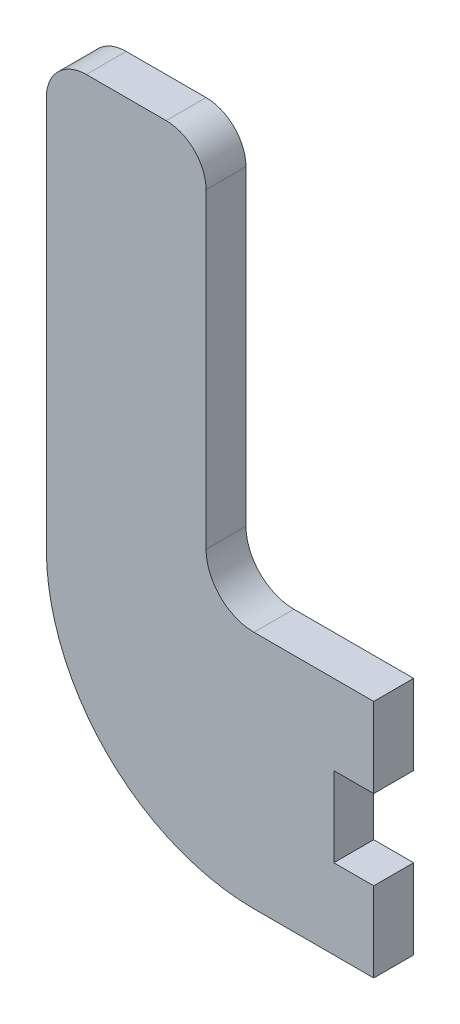
ISO-10303-21;
HEADER;
FILE_DESCRIPTION(('STEP AP214'),'2;1');
FILE_NAME('part.step','',(''),(''),'','','');
FILE_SCHEMA(('AUTOMOTIVE_DESIGN { 1 0 10303 214 1 1 1 1 }'));
ENDSEC;
DATA;
#1=APPLICATION_CONTEXT('core data for automotive mechanical design processes');
#2=APPLICATION_PROTOCOL_DEFINITION('international standard','automotive_design',2000,#1);
#3=PRODUCT_CONTEXT('',#1,'mechanical');
#4=PRODUCT('Part','Part','',(#3));
#5=PRODUCT_RELATED_PRODUCT_CATEGORY('part','',(#4));
#6=PRODUCT_DEFINITION_FORMATION('','',#4);
#7=PRODUCT_DEFINITION_CONTEXT('part definition',#1,'design');
#8=PRODUCT_DEFINITION('design','',#6,#7);
#9=PRODUCT_DEFINITION_SHAPE('','',#8);
#10=(LENGTH_UNIT() NAMED_UNIT(*) SI_UNIT(.MILLI.,.METRE.));
#11=(NAMED_UNIT(*) PLANE_ANGLE_UNIT() SI_UNIT($,.RADIAN.));
#12=(NAMED_UNIT(*) SI_UNIT($,.STERADIAN.) SOLID_ANGLE_UNIT());
#13=UNCERTAINTY_MEASURE_WITH_UNIT(LENGTH_MEASURE(1.E-05),#10,'distance_accuracy_value','');
#14=(GEOMETRIC_REPRESENTATION_CONTEXT(3) GLOBAL_UNCERTAINTY_ASSIGNED_CONTEXT((#13)) GLOBAL_UNIT_ASSIGNED_CONTEXT((#10,
#11,#12)) REPRESENTATION_CONTEXT('',''));
#15=CARTESIAN_POINT('',(0.,0.,0.));
#16=DIRECTION('',(0.,0.,1.));
#17=DIRECTION('',(1.,0.,0.));
#18=AXIS2_PLACEMENT_3D('',#15,#16,#17);
#19=CARTESIAN_POINT('',(0.,0.,3.175));
#20=DIRECTION('',(0.,1.,0.));
#21=DIRECTION('',(-1.,0.,0.));
#22=AXIS2_PLACEMENT_3D('',#19,#20,#21);
#23=PLANE('',#22);
#24=DIRECTION('',(1.,0.,0.));
#25=VECTOR('',#24,1.);
#26=CARTESIAN_POINT('',(0.,0.,0.));
#27=LINE('',#26,#25);
#28=CARTESIAN_POINT('',(-6.35,0.,0.));
#29=VERTEX_POINT('',#28);
#30=CARTESIAN_POINT('',(3.175,0.,0.));
#31=VERTEX_POINT('',#30);
#32=EDGE_CURVE('E150',#29,#31,#27,.T.);
#33=ORIENTED_EDGE('',*,*,#32,.T.);
#34=DIRECTION('',(0.,0.,-1.));
#35=VECTOR('',#34,1.);
#36=CARTESIAN_POINT('',(3.175,0.,3.175));
#37=LINE('',#36,#35);
#38=CARTESIAN_POINT('',(3.175,0.,3.175));
#39=VERTEX_POINT('',#38);
#40=EDGE_CURVE('E149',#39,#31,#37,.T.);
#41=ORIENTED_EDGE('',*,*,#40,.F.);
#42=DIRECTION('',(1.,0.,0.));
#43=VECTOR('',#42,1.);
#44=CARTESIAN_POINT('',(0.,0.,3.175));
#45=LINE('',#44,#43);
#46=CARTESIAN_POINT('',(-6.35,0.,3.175));
#47=VERTEX_POINT('',#46);
#48=EDGE_CURVE('E135',#47,#39,#45,.T.);
#49=ORIENTED_EDGE('',*,*,#48,.F.);
#50=DIRECTION('',(0.,0.,-1.));
#51=VECTOR('',#50,1.);
#52=CARTESIAN_POINT('',(-6.35,0.,3.175));
#53=LINE('',#52,#51);
#54=EDGE_CURVE('E180',#47,#29,#53,.T.);
#55=ORIENTED_EDGE('',*,*,#54,.T.);
#56=EDGE_LOOP('',(#33,#41,#49,#55));
#57=FACE_BOUND('',#56,.T.);
#58=ADVANCED_FACE('F33',(#57),#23,.F.);
#59=CARTESIAN_POINT('',(3.175,0.,3.175));
#60=DIRECTION('',(-1.,0.,0.));
#61=DIRECTION('',(0.,0.,1.));
#62=AXIS2_PLACEMENT_3D('',#59,#60,#61);
#63=PLANE('',#62);
#64=DIRECTION('',(0.,1.,0.));
#65=VECTOR('',#64,1.);
#66=CARTESIAN_POINT('',(3.175,0.,0.));
#67=LINE('',#66,#65);
#68=CARTESIAN_POINT('',(3.175,6.35,0.));
#69=VERTEX_POINT('',#68);
#70=EDGE_CURVE('E182',#31,#69,#67,.T.);
#71=ORIENTED_EDGE('',*,*,#70,.T.);
#72=DIRECTION('',(0.,0.,-1.));
#73=VECTOR('',#72,1.);
#74=CARTESIAN_POINT('',(3.175,6.35,3.175));
#75=LINE('',#74,#73);
#76=CARTESIAN_POINT('',(3.175,6.35,3.175));
#77=VERTEX_POINT('',#76);
#78=EDGE_CURVE('E154',#77,#69,#75,.T.);
#79=ORIENTED_EDGE('',*,*,#78,.F.);
#80=DIRECTION('',(0.,1.,0.));
#81=VECTOR('',#80,1.);
#82=CARTESIAN_POINT('',(3.175,0.,3.175));
#83=LINE('',#82,#81);
#84=EDGE_CURVE('E139',#39,#77,#83,.T.);
#85=ORIENTED_EDGE('',*,*,#84,.F.);
#86=ORIENTED_EDGE('',*,*,#40,.T.);
#87=EDGE_LOOP('',(#71,#79,#85,#86));
#88=FACE_BOUND('',#87,.T.);
#89=ADVANCED_FACE('F156',(#88),#63,.F.);
#90=CARTESIAN_POINT('',(3.175,6.35,3.175));
#91=DIRECTION('',(0.,-1.,0.));
#92=DIRECTION('',(1.,0.,0.));
#93=AXIS2_PLACEMENT_3D('',#90,#91,#92);
#94=PLANE('',#93);
#95=DIRECTION('',(-1.,0.,0.));
#96=VECTOR('',#95,1.);
#97=CARTESIAN_POINT('',(3.175,6.35,0.));
#98=LINE('',#97,#96);
#99=CARTESIAN_POINT('',(0.,6.35,0.));
#100=VERTEX_POINT('',#99);
#101=EDGE_CURVE('E184',#69,#100,#98,.T.);
#102=ORIENTED_EDGE('',*,*,#101,.T.);
#103=DIRECTION('',(0.,0.,-1.));
#104=VECTOR('',#103,1.);
#105=CARTESIAN_POINT('',(0.,6.35,3.175));
#106=LINE('',#105,#104);
#107=CARTESIAN_POINT('',(0.,6.35,3.175));
#108=VERTEX_POINT('',#107);
#109=EDGE_CURVE('E225',#108,#100,#106,.T.);
#110=ORIENTED_EDGE('',*,*,#109,.F.);
#111=DIRECTION('',(-1.,0.,0.));
#112=VECTOR('',#111,1.);
#113=CARTESIAN_POINT('',(3.175,6.35,3.175));
#114=LINE('',#113,#112);
#115=EDGE_CURVE('E159',#77,#108,#114,.T.);
#116=ORIENTED_EDGE('',*,*,#115,.F.);
#117=ORIENTED_EDGE('',*,*,#78,.T.);
#118=EDGE_LOOP('',(#102,#110,#116,#117));
#119=FACE_BOUND('',#118,.T.);
#120=ADVANCED_FACE('F278',(#119),#94,.F.);
#121=CARTESIAN_POINT('',(0.,6.35,3.175));
#122=DIRECTION('',(-1.,0.,0.));
#123=DIRECTION('',(0.,0.,1.));
#124=AXIS2_PLACEMENT_3D('',#121,#122,#123);
#125=PLANE('',#124);
#126=DIRECTION('',(0.,1.,0.));
#127=VECTOR('',#126,1.);
#128=CARTESIAN_POINT('',(0.,6.35,0.));
#129=LINE('',#128,#127);
#130=CARTESIAN_POINT('',(0.,12.7,0.));
#131=VERTEX_POINT('',#130);
#132=EDGE_CURVE('E186',#100,#131,#129,.T.);
#133=ORIENTED_EDGE('',*,*,#132,.T.);
#134=DIRECTION('',(0.,0.,-1.));
#135=VECTOR('',#134,1.);
#136=CARTESIAN_POINT('',(0.,12.7,3.175));
#137=LINE('',#136,#135);
#138=CARTESIAN_POINT('',(0.,12.7,3.175));
#139=VERTEX_POINT('',#138);
#140=EDGE_CURVE('E222',#139,#131,#137,.T.);
#141=ORIENTED_EDGE('',*,*,#140,.F.);
#142=DIRECTION('',(0.,1.,0.));
#143=VECTOR('',#142,1.);
#144=CARTESIAN_POINT('',(0.,6.35,3.175));
#145=LINE('',#144,#143);
#146=EDGE_CURVE('E161',#108,#139,#145,.T.);
#147=ORIENTED_EDGE('',*,*,#146,.F.);
#148=ORIENTED_EDGE('',*,*,#109,.T.);
#149=EDGE_LOOP('',(#133,#141,#147,#148));
#150=FACE_BOUND('',#149,.T.);
#151=ADVANCED_FACE('F275',(#150),#125,.F.);
#152=CARTESIAN_POINT('',(0.,12.7,3.175));
#153=DIRECTION('',(0.,1.,0.));
#154=DIRECTION('',(-1.,0.,0.));
#155=AXIS2_PLACEMENT_3D('',#152,#153,#154);
#156=PLANE('',#155);
#157=DIRECTION('',(1.,0.,0.));
#158=VECTOR('',#157,1.);
#159=CARTESIAN_POINT('',(0.,12.7,0.));
#160=LINE('',#159,#158);
#161=CARTESIAN_POINT('',(3.175,12.7,0.));
#162=VERTEX_POINT('',#161);
#163=EDGE_CURVE('E188',#131,#162,#160,.T.);
#164=ORIENTED_EDGE('',*,*,#163,.T.);
#165=DIRECTION('',(0.,0.,-1.));
#166=VECTOR('',#165,1.);
#167=CARTESIAN_POINT('',(3.175,12.7,3.175));
#168=LINE('',#167,#166);
#169=CARTESIAN_POINT('',(3.175,12.7,3.175));
#170=VERTEX_POINT('',#169);
#171=EDGE_CURVE('E219',#170,#162,#168,.T.);
#172=ORIENTED_EDGE('',*,*,#171,.F.);
#173=DIRECTION('',(1.,0.,0.));
#174=VECTOR('',#173,1.);
#175=CARTESIAN_POINT('',(0.,12.7,3.175));
#176=LINE('',#175,#174);
#177=EDGE_CURVE('E165',#139,#170,#176,.T.);
#178=ORIENTED_EDGE('',*,*,#177,.F.);
#179=ORIENTED_EDGE('',*,*,#140,.T.);
#180=EDGE_LOOP('',(#164,#172,#178,#179));
#181=FACE_BOUND('',#180,.T.);
#182=ADVANCED_FACE('F271',(#181),#156,.F.);
#183=CARTESIAN_POINT('',(3.175,12.7,3.175));
#184=DIRECTION('',(-1.,0.,0.));
#185=DIRECTION('',(0.,0.,1.));
#186=AXIS2_PLACEMENT_3D('',#183,#184,#185);
#187=PLANE('',#186);
#188=DIRECTION('',(0.,1.,0.));
#189=VECTOR('',#188,1.);
#190=CARTESIAN_POINT('',(3.175,12.7,0.));
#191=LINE('',#190,#189);
#192=CARTESIAN_POINT('',(3.175,19.05,0.));
#193=VERTEX_POINT('',#192);
#194=EDGE_CURVE('E190',#162,#193,#191,.T.);
#195=ORIENTED_EDGE('',*,*,#194,.T.);
#196=DIRECTION('',(0.,0.,-1.));
#197=VECTOR('',#196,1.);
#198=CARTESIAN_POINT('',(3.175,19.05,3.175));
#199=LINE('',#198,#197);
#200=CARTESIAN_POINT('',(3.175,19.05,3.175));
#201=VERTEX_POINT('',#200);
#202=EDGE_CURVE('E216',#201,#193,#199,.T.);
#203=ORIENTED_EDGE('',*,*,#202,.F.);
#204=DIRECTION('',(0.,1.,0.));
#205=VECTOR('',#204,1.);
#206=CARTESIAN_POINT('',(3.175,12.7,3.175));
#207=LINE('',#206,#205);
#208=EDGE_CURVE('E167',#170,#201,#207,.T.);
#209=ORIENTED_EDGE('',*,*,#208,.F.);
#210=ORIENTED_EDGE('',*,*,#171,.T.);
#211=EDGE_LOOP('',(#195,#203,#209,#210));
#212=FACE_BOUND('',#211,.T.);
#213=ADVANCED_FACE('F262',(#212),#187,.F.);
#214=CARTESIAN_POINT('',(0.,19.05,3.175));
#215=DIRECTION('',(0.,-1.,0.));
#216=DIRECTION('',(0.,0.,-1.));
#217=AXIS2_PLACEMENT_3D('',#214,#215,#216);
#218=PLANE('',#217);
#219=DIRECTION('',(-1.,0.,0.));
#220=VECTOR('',#219,1.);
#221=CARTESIAN_POINT('',(0.,19.05,0.));
#222=LINE('',#221,#220);
#223=CARTESIAN_POINT('',(-6.35,19.05,0.));
#224=VERTEX_POINT('',#223);
#225=EDGE_CURVE('E193',#193,#224,#222,.T.);
#226=ORIENTED_EDGE('',*,*,#225,.T.);
#227=DIRECTION('',(0.,0.,-1.));
#228=VECTOR('',#227,1.);
#229=CARTESIAN_POINT('',(-6.35,19.05,3.175));
#230=LINE('',#229,#228);
#231=CARTESIAN_POINT('',(-6.35,19.05,3.175));
#232=VERTEX_POINT('',#231);
#233=EDGE_CURVE('E213',#232,#224,#230,.T.);
#234=ORIENTED_EDGE('',*,*,#233,.F.);
#235=DIRECTION('',(-1.,0.,0.));
#236=VECTOR('',#235,1.);
#237=CARTESIAN_POINT('',(3.175,19.05,3.175));
#238=LINE('',#237,#236);
#239=EDGE_CURVE('E169',#201,#232,#238,.T.);
#240=ORIENTED_EDGE('',*,*,#239,.F.);
#241=ORIENTED_EDGE('',*,*,#202,.T.);
#242=EDGE_LOOP('',(#226,#234,#240,#241));
#243=FACE_BOUND('',#242,.T.);
#244=ADVANCED_FACE('F266',(#243),#218,.F.);
#245=CARTESIAN_POINT('',(-6.35,22.86,3.175));
#246=DIRECTION('',(0.,0.,-1.));
#247=DIRECTION('',(-1.,0.,0.));
#248=AXIS2_PLACEMENT_3D('',#245,#246,#247);
#249=CYLINDRICAL_SURFACE('',#248,3.80999999999999);
#250=CARTESIAN_POINT('',(-6.35,22.86,0.));
#251=DIRECTION('',(0.,0.,-1.));
#252=DIRECTION('',(-1.,0.,0.));
#253=AXIS2_PLACEMENT_3D('',#250,#251,#252);
#254=CIRCLE('',#253,3.80999999999999);
#255=CARTESIAN_POINT('',(-10.16,22.86,0.));
#256=VERTEX_POINT('',#255);
#257=EDGE_CURVE('E195',#224,#256,#254,.T.);
#258=ORIENTED_EDGE('',*,*,#257,.T.);
#259=DIRECTION('',(0.,0.,-1.));
#260=VECTOR('',#259,1.);
#261=CARTESIAN_POINT('',(-10.16,22.86,3.175));
#262=LINE('',#261,#260);
#263=CARTESIAN_POINT('',(-10.16,22.86,3.175));
#264=VERTEX_POINT('',#263);
#265=EDGE_CURVE('E210',#264,#256,#262,.T.);
#266=ORIENTED_EDGE('',*,*,#265,.F.);
#267=CARTESIAN_POINT('',(-6.35,22.86,3.175));
#268=DIRECTION('',(0.,0.,-1.));
#269=DIRECTION('',(-1.,0.,0.));
#270=AXIS2_PLACEMENT_3D('',#267,#268,#269);
#271=CIRCLE('',#270,3.80999999999999);
#272=EDGE_CURVE('E171',#232,#264,#271,.T.);
#273=ORIENTED_EDGE('',*,*,#272,.F.);
#274=ORIENTED_EDGE('',*,*,#233,.T.);
#275=EDGE_LOOP('',(#258,#266,#273,#274));
#276=FACE_BOUND('',#275,.T.);
#277=ADVANCED_FACE('F255',(#276),#249,.F.);
#278=CARTESIAN_POINT('',(-10.16,22.86,3.175));
#279=DIRECTION('',(-1.,0.,0.));
#280=DIRECTION('',(0.,-1.,0.));
#281=AXIS2_PLACEMENT_3D('',#278,#279,#280);
#282=PLANE('',#281);
#283=DIRECTION('',(0.,1.,0.));
#284=VECTOR('',#283,1.);
#285=CARTESIAN_POINT('',(-10.16,22.86,0.));
#286=LINE('',#285,#284);
#287=CARTESIAN_POINT('',(-10.16,47.625,0.));
#288=VERTEX_POINT('',#287);
#289=EDGE_CURVE('E197',#256,#288,#286,.T.);
#290=ORIENTED_EDGE('',*,*,#289,.T.);
#291=DIRECTION('',(0.,0.,-1.));
#292=VECTOR('',#291,1.);
#293=CARTESIAN_POINT('',(-10.16,47.625,3.175));
#294=LINE('',#293,#292);
#295=CARTESIAN_POINT('',(-10.16,47.625,3.175));
#296=VERTEX_POINT('',#295);
#297=EDGE_CURVE('E56',#288,#296,#294,.F.);
#298=ORIENTED_EDGE('',*,*,#297,.T.);
#299=DIRECTION('',(0.,1.,0.));
#300=VECTOR('',#299,1.);
#301=CARTESIAN_POINT('',(-10.16,22.86,3.175));
#302=LINE('',#301,#300);
#303=EDGE_CURVE('E173',#264,#296,#302,.T.);
#304=ORIENTED_EDGE('',*,*,#303,.F.);
#305=ORIENTED_EDGE('',*,*,#265,.T.);
#306=EDGE_LOOP('',(#290,#298,#304,#305));
#307=FACE_BOUND('',#306,.T.);
#308=ADVANCED_FACE('F251',(#307),#282,.F.);
#309=CARTESIAN_POINT('',(-22.86,50.8,3.175));
#310=DIRECTION('',(0.,-1.,0.));
#311=DIRECTION('',(0.,0.,-1.));
#312=AXIS2_PLACEMENT_3D('',#309,#310,#311);
#313=PLANE('',#312);
#314=DIRECTION('',(-1.,0.,0.));
#315=VECTOR('',#314,1.);
#316=CARTESIAN_POINT('',(-22.86,50.8,3.175));
#317=LINE('',#316,#315);
#318=CARTESIAN_POINT('',(-13.335,50.8,3.175));
#319=VERTEX_POINT('',#318);
#320=CARTESIAN_POINT('',(-19.685,50.8,3.175));
#321=VERTEX_POINT('',#320);
#322=EDGE_CURVE('E175',#319,#321,#317,.T.);
#323=ORIENTED_EDGE('',*,*,#322,.F.);
#324=DIRECTION('',(0.,0.,-1.));
#325=VECTOR('',#324,1.);
#326=CARTESIAN_POINT('',(-13.335,50.8,3.175));
#327=LINE('',#326,#325);
#328=CARTESIAN_POINT('',(-13.335,50.8,0.));
#329=VERTEX_POINT('',#328);
#330=EDGE_CURVE('E230',#319,#329,#327,.T.);
#331=ORIENTED_EDGE('',*,*,#330,.T.);
#332=DIRECTION('',(-1.,0.,0.));
#333=VECTOR('',#332,1.);
#334=CARTESIAN_POINT('',(-22.86,50.8,0.));
#335=LINE('',#334,#333);
#336=CARTESIAN_POINT('',(-19.685,50.8,0.));
#337=VERTEX_POINT('',#336);
#338=EDGE_CURVE('E199',#329,#337,#335,.T.);
#339=ORIENTED_EDGE('',*,*,#338,.T.);
#340=DIRECTION('',(0.,0.,-1.));
#341=VECTOR('',#340,1.);
#342=CARTESIAN_POINT('',(-19.685,50.8,3.175));
#343=LINE('',#342,#341);
#344=EDGE_CURVE('E153',#337,#321,#343,.F.);
#345=ORIENTED_EDGE('',*,*,#344,.T.);
#346=EDGE_LOOP('',(#323,#331,#339,#345));
#347=FACE_BOUND('',#346,.T.);
#348=ADVANCED_FACE('F243',(#347),#313,.F.);
#349=CARTESIAN_POINT('',(-22.86,16.51,3.175));
#350=DIRECTION('',(1.,0.,0.));
#351=DIRECTION('',(0.,0.,-1.));
#352=AXIS2_PLACEMENT_3D('',#349,#350,#351);
#353=PLANE('',#352);
#354=DIRECTION('',(0.,-1.,0.));
#355=VECTOR('',#354,1.);
#356=CARTESIAN_POINT('',(-22.86,16.51,3.175));
#357=LINE('',#356,#355);
#358=CARTESIAN_POINT('',(-22.86,47.625,3.175));
#359=VERTEX_POINT('',#358);
#360=CARTESIAN_POINT('',(-22.86,16.51,3.175));
#361=VERTEX_POINT('',#360);
#362=EDGE_CURVE('E177',#359,#361,#357,.T.);
#363=ORIENTED_EDGE('',*,*,#362,.F.);
#364=DIRECTION('',(0.,0.,-1.));
#365=VECTOR('',#364,1.);
#366=CARTESIAN_POINT('',(-22.86,47.625,3.175));
#367=LINE('',#366,#365);
#368=CARTESIAN_POINT('',(-22.86,47.625,0.));
#369=VERTEX_POINT('',#368);
#370=EDGE_CURVE('E11',#359,#369,#367,.T.);
#371=ORIENTED_EDGE('',*,*,#370,.T.);
#372=DIRECTION('',(0.,-1.,0.));
#373=VECTOR('',#372,1.);
#374=CARTESIAN_POINT('',(-22.86,16.51,0.));
#375=LINE('',#374,#373);
#376=CARTESIAN_POINT('',(-22.86,16.51,0.));
#377=VERTEX_POINT('',#376);
#378=EDGE_CURVE('E202',#369,#377,#375,.T.);
#379=ORIENTED_EDGE('',*,*,#378,.T.);
#380=DIRECTION('',(0.,0.,-1.));
#381=VECTOR('',#380,1.);
#382=CARTESIAN_POINT('',(-22.86,16.51,3.175));
#383=LINE('',#382,#381);
#384=EDGE_CURVE('E207',#361,#377,#383,.T.);
#385=ORIENTED_EDGE('',*,*,#384,.F.);
#386=EDGE_LOOP('',(#363,#371,#379,#385));
#387=FACE_BOUND('',#386,.T.);
#388=ADVANCED_FACE('F306',(#387),#353,.F.);
#389=CARTESIAN_POINT('',(-6.35,16.51,3.175));
#390=DIRECTION('',(0.,0.,-1.));
#391=DIRECTION('',(-1.,0.,0.));
#392=AXIS2_PLACEMENT_3D('',#389,#390,#391);
#393=CYLINDRICAL_SURFACE('',#392,16.51);
#394=CARTESIAN_POINT('',(-6.35,16.51,0.));
#395=DIRECTION('',(0.,0.,1.));
#396=DIRECTION('',(-1.,0.,0.));
#397=AXIS2_PLACEMENT_3D('',#394,#395,#396);
#398=CIRCLE('',#397,16.51);
#399=EDGE_CURVE('E146',#377,#29,#398,.T.);
#400=ORIENTED_EDGE('',*,*,#399,.T.);
#401=ORIENTED_EDGE('',*,*,#54,.F.);
#402=CARTESIAN_POINT('',(-6.35,16.51,3.175));
#403=DIRECTION('',(0.,0.,1.));
#404=DIRECTION('',(-1.,0.,0.));
#405=AXIS2_PLACEMENT_3D('',#402,#403,#404);
#406=CIRCLE('',#405,16.51);
#407=EDGE_CURVE('E142',#361,#47,#406,.T.);
#408=ORIENTED_EDGE('',*,*,#407,.F.);
#409=ORIENTED_EDGE('',*,*,#384,.T.);
#410=EDGE_LOOP('',(#400,#401,#408,#409));
#411=FACE_BOUND('',#410,.T.);
#412=ADVANCED_FACE('F301',(#411),#393,.T.);
#413=CARTESIAN_POINT('',(-6.35,16.51,3.175));
#414=DIRECTION('',(0.,0.,-1.));
#415=DIRECTION('',(-1.,0.,0.));
#416=AXIS2_PLACEMENT_3D('',#413,#414,#415);
#417=PLANE('',#416);
#418=ORIENTED_EDGE('',*,*,#303,.T.);
#419=CARTESIAN_POINT('',(-13.335,47.625,3.175));
#420=DIRECTION('',(0.,0.,-1.));
#421=DIRECTION('',(-1.,0.,0.));
#422=AXIS2_PLACEMENT_3D('',#419,#420,#421);
#423=CIRCLE('',#422,3.175);
#424=EDGE_CURVE('E41',#296,#319,#423,.F.);
#425=ORIENTED_EDGE('',*,*,#424,.T.);
#426=ORIENTED_EDGE('',*,*,#322,.T.);
#427=CARTESIAN_POINT('',(-19.685,47.625,3.175));
#428=DIRECTION('',(0.,0.,-1.));
#429=DIRECTION('',(-1.,0.,0.));
#430=AXIS2_PLACEMENT_3D('',#427,#428,#429);
#431=CIRCLE('',#430,3.175);
#432=EDGE_CURVE('E48',#321,#359,#431,.F.);
#433=ORIENTED_EDGE('',*,*,#432,.T.);
#434=ORIENTED_EDGE('',*,*,#362,.T.);
#435=ORIENTED_EDGE('',*,*,#407,.T.);
#436=ORIENTED_EDGE('',*,*,#48,.T.);
#437=ORIENTED_EDGE('',*,*,#84,.T.);
#438=ORIENTED_EDGE('',*,*,#115,.T.);
#439=ORIENTED_EDGE('',*,*,#146,.T.);
#440=ORIENTED_EDGE('',*,*,#177,.T.);
#441=ORIENTED_EDGE('',*,*,#208,.T.);
#442=ORIENTED_EDGE('',*,*,#239,.T.);
#443=ORIENTED_EDGE('',*,*,#272,.T.);
#444=EDGE_LOOP('',(#418,#425,#426,#433,#434,#435,#436,#437,#438,#439,#440,#441,#442,#443));
#445=FACE_BOUND('',#444,.T.);
#446=ADVANCED_FACE('F137',(#445),#417,.F.);
#447=CARTESIAN_POINT('',(-6.35,16.51,0.));
#448=DIRECTION('',(0.,0.,-1.));
#449=DIRECTION('',(-1.,0.,0.));
#450=AXIS2_PLACEMENT_3D('',#447,#448,#449);
#451=PLANE('',#450);
#452=ORIENTED_EDGE('',*,*,#338,.F.);
#453=CARTESIAN_POINT('',(-13.335,47.625,0.));
#454=DIRECTION('',(0.,0.,-1.));
#455=DIRECTION('',(-1.,0.,0.));
#456=AXIS2_PLACEMENT_3D('',#453,#454,#455);
#457=CIRCLE('',#456,3.175);
#458=EDGE_CURVE('E235',#329,#288,#457,.T.);
#459=ORIENTED_EDGE('',*,*,#458,.T.);
#460=ORIENTED_EDGE('',*,*,#289,.F.);
#461=ORIENTED_EDGE('',*,*,#257,.F.);
#462=ORIENTED_EDGE('',*,*,#225,.F.);
#463=ORIENTED_EDGE('',*,*,#194,.F.);
#464=ORIENTED_EDGE('',*,*,#163,.F.);
#465=ORIENTED_EDGE('',*,*,#132,.F.);
#466=ORIENTED_EDGE('',*,*,#101,.F.);
#467=ORIENTED_EDGE('',*,*,#70,.F.);
#468=ORIENTED_EDGE('',*,*,#32,.F.);
#469=ORIENTED_EDGE('',*,*,#399,.F.);
#470=ORIENTED_EDGE('',*,*,#378,.F.);
#471=CARTESIAN_POINT('',(-19.685,47.625,0.));
#472=DIRECTION('',(0.,0.,-1.));
#473=DIRECTION('',(-1.,0.,0.));
#474=AXIS2_PLACEMENT_3D('',#471,#472,#473);
#475=CIRCLE('',#474,3.175);
#476=EDGE_CURVE('E233',#369,#337,#475,.T.);
#477=ORIENTED_EDGE('',*,*,#476,.T.);
#478=EDGE_LOOP('',(#452,#459,#460,#461,#462,#463,#464,#465,#466,#467,#468,#469,#470,#477));
#479=FACE_BOUND('',#478,.T.);
#480=ADVANCED_FACE('F249',(#479),#451,.T.);
#481=CARTESIAN_POINT('',(-13.335,47.625,3.175));
#482=DIRECTION('',(0.,0.,-1.));
#483=DIRECTION('',(-1.,0.,0.));
#484=AXIS2_PLACEMENT_3D('',#481,#482,#483);
#485=CYLINDRICAL_SURFACE('',#484,3.175);
#486=ORIENTED_EDGE('',*,*,#424,.F.);
#487=ORIENTED_EDGE('',*,*,#297,.F.);
#488=ORIENTED_EDGE('',*,*,#458,.F.);
#489=ORIENTED_EDGE('',*,*,#330,.F.);
#490=EDGE_LOOP('',(#486,#487,#488,#489));
#491=FACE_BOUND('',#490,.T.);
#492=ADVANCED_FACE('F246',(#491),#485,.T.);
#493=CARTESIAN_POINT('',(-19.685,47.625,3.175));
#494=DIRECTION('',(0.,0.,-1.));
#495=DIRECTION('',(-1.,0.,0.));
#496=AXIS2_PLACEMENT_3D('',#493,#494,#495);
#497=CYLINDRICAL_SURFACE('',#496,3.175);
#498=ORIENTED_EDGE('',*,*,#432,.F.);
#499=ORIENTED_EDGE('',*,*,#344,.F.);
#500=ORIENTED_EDGE('',*,*,#476,.F.);
#501=ORIENTED_EDGE('',*,*,#370,.F.);
#502=EDGE_LOOP('',(#498,#499,#500,#501));
#503=FACE_BOUND('',#502,.T.);
#504=ADVANCED_FACE('F35',(#503),#497,.T.);
#505=CLOSED_SHELL('',(#58,#89,#120,#151,#182,#213,#244,#277,#308,#348,#388,#412,#446,#480,#492,#504));
#506=MANIFOLD_SOLID_BREP('B2',#505);
#507=ADVANCED_BREP_SHAPE_REPRESENTATION('',(#18,#506),#14);
#508=SHAPE_DEFINITION_REPRESENTATION(#9,#507);
ENDSEC;
END-ISO-10303-21;
